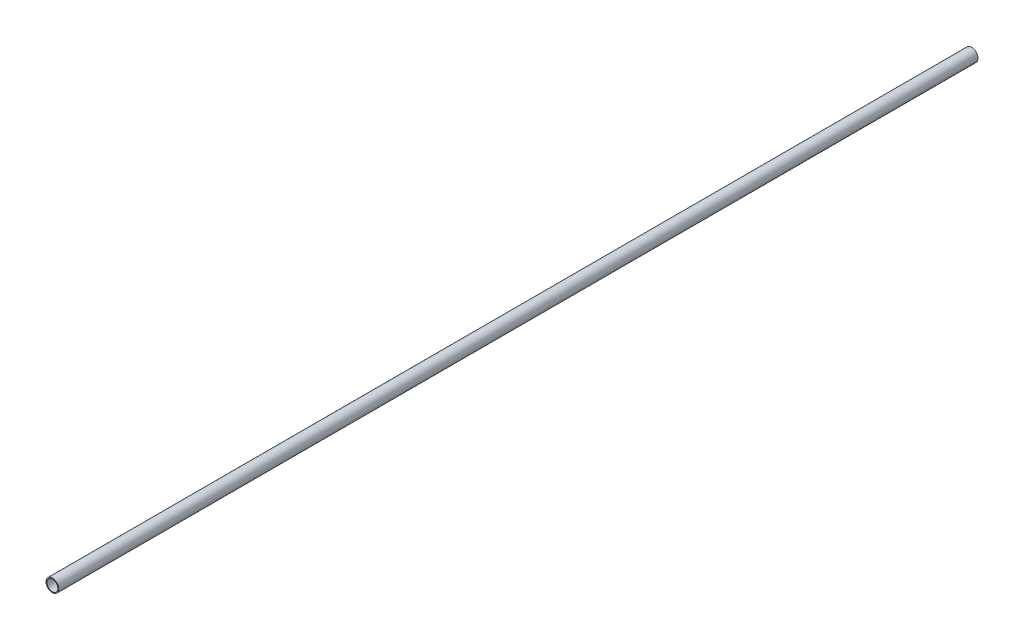
ISO-10303-21;
HEADER;
FILE_DESCRIPTION(('STEP AP214'),'2;1');
FILE_NAME('part.step','',(''),(''),'','','');
FILE_SCHEMA(('AUTOMOTIVE_DESIGN { 1 0 10303 214 1 1 1 1 }'));
ENDSEC;
DATA;
#1=APPLICATION_CONTEXT('core data for automotive mechanical design processes');
#2=APPLICATION_PROTOCOL_DEFINITION('international standard','automotive_design',2000,#1);
#3=PRODUCT_CONTEXT('',#1,'mechanical');
#4=PRODUCT('Part','Part','',(#3));
#5=PRODUCT_RELATED_PRODUCT_CATEGORY('part','',(#4));
#6=PRODUCT_DEFINITION_FORMATION('','',#4);
#7=PRODUCT_DEFINITION_CONTEXT('part definition',#1,'design');
#8=PRODUCT_DEFINITION('design','',#6,#7);
#9=PRODUCT_DEFINITION_SHAPE('','',#8);
#10=(LENGTH_UNIT() NAMED_UNIT(*) SI_UNIT(.MILLI.,.METRE.));
#11=(NAMED_UNIT(*) PLANE_ANGLE_UNIT() SI_UNIT($,.RADIAN.));
#12=(NAMED_UNIT(*) SI_UNIT($,.STERADIAN.) SOLID_ANGLE_UNIT());
#13=UNCERTAINTY_MEASURE_WITH_UNIT(LENGTH_MEASURE(1.E-05),#10,'distance_accuracy_value','');
#14=(GEOMETRIC_REPRESENTATION_CONTEXT(3) GLOBAL_UNCERTAINTY_ASSIGNED_CONTEXT((#13)) GLOBAL_UNIT_ASSIGNED_CONTEXT((#10,
#11,#12)) REPRESENTATION_CONTEXT('',''));
#15=CARTESIAN_POINT('',(0.,0.,0.));
#16=DIRECTION('',(0.,0.,1.));
#17=DIRECTION('',(1.,0.,0.));
#18=AXIS2_PLACEMENT_3D('',#15,#16,#17);
#19=CARTESIAN_POINT('',(0.,0.,-457.2));
#20=DIRECTION('',(0.,0.,1.));
#21=DIRECTION('',(1.,0.,0.));
#22=AXIS2_PLACEMENT_3D('',#19,#20,#21);
#23=CYLINDRICAL_SURFACE('',#22,6.35);
#24=CARTESIAN_POINT('',(0.,0.,-457.2));
#25=DIRECTION('',(0.,0.,1.));
#26=DIRECTION('',(1.,0.,0.));
#27=AXIS2_PLACEMENT_3D('',#24,#25,#26);
#28=CIRCLE('',#27,6.35);
#29=CARTESIAN_POINT('',(6.35,0.,-457.2));
#30=VERTEX_POINT('',#29);
#31=EDGE_CURVE('E10',#30,#30,#28,.T.);
#32=ORIENTED_EDGE('',*,*,#31,.T.);
#33=EDGE_LOOP('',(#32));
#34=FACE_BOUND('',#33,.T.);
#35=CARTESIAN_POINT('',(0.,0.,457.2));
#36=DIRECTION('',(0.,0.,1.));
#37=DIRECTION('',(1.,0.,0.));
#38=AXIS2_PLACEMENT_3D('',#35,#36,#37);
#39=CIRCLE('',#38,6.35);
#40=CARTESIAN_POINT('',(6.35,0.,457.2));
#41=VERTEX_POINT('',#40);
#42=EDGE_CURVE('E46',#41,#41,#39,.T.);
#43=ORIENTED_EDGE('',*,*,#42,.F.);
#44=EDGE_LOOP('',(#43));
#45=FACE_BOUND('',#44,.T.);
#46=ADVANCED_FACE('F36',(#34,#45),#23,.T.);
#47=CARTESIAN_POINT('',(0.,0.,-457.2));
#48=DIRECTION('',(0.,0.,1.));
#49=DIRECTION('',(1.,0.,0.));
#50=AXIS2_PLACEMENT_3D('',#47,#48,#49);
#51=PLANE('',#50);
#52=CARTESIAN_POINT('',(0.,0.,-457.2));
#53=DIRECTION('',(0.,0.,1.));
#54=DIRECTION('',(1.,0.,0.));
#55=AXIS2_PLACEMENT_3D('',#52,#53,#54);
#56=CIRCLE('',#55,5.461);
#57=CARTESIAN_POINT('',(5.461,0.,-457.2));
#58=VERTEX_POINT('',#57);
#59=EDGE_CURVE('E42',#58,#58,#56,.T.);
#60=ORIENTED_EDGE('',*,*,#59,.T.);
#61=EDGE_LOOP('',(#60));
#62=FACE_BOUND('',#61,.T.);
#63=ORIENTED_EDGE('',*,*,#31,.F.);
#64=EDGE_LOOP('',(#63));
#65=FACE_BOUND('',#64,.T.);
#66=ADVANCED_FACE('F65',(#62,#65),#51,.F.);
#67=CARTESIAN_POINT('',(0.,0.,-457.2));
#68=DIRECTION('',(0.,0.,1.));
#69=DIRECTION('',(1.,0.,0.));
#70=AXIS2_PLACEMENT_3D('',#67,#68,#69);
#71=CYLINDRICAL_SURFACE('',#70,5.461);
#72=ORIENTED_EDGE('',*,*,#59,.F.);
#73=EDGE_LOOP('',(#72));
#74=FACE_BOUND('',#73,.T.);
#75=CARTESIAN_POINT('',(0.,0.,457.2));
#76=DIRECTION('',(0.,0.,1.));
#77=DIRECTION('',(1.,0.,0.));
#78=AXIS2_PLACEMENT_3D('',#75,#76,#77);
#79=CIRCLE('',#78,5.461);
#80=CARTESIAN_POINT('',(5.461,0.,457.2));
#81=VERTEX_POINT('',#80);
#82=EDGE_CURVE('E50',#81,#81,#79,.T.);
#83=ORIENTED_EDGE('',*,*,#82,.T.);
#84=EDGE_LOOP('',(#83));
#85=FACE_BOUND('',#84,.T.);
#86=ADVANCED_FACE('F56',(#74,#85),#71,.F.);
#87=CARTESIAN_POINT('',(0.,0.,457.2));
#88=DIRECTION('',(0.,0.,1.));
#89=DIRECTION('',(1.,0.,0.));
#90=AXIS2_PLACEMENT_3D('',#87,#88,#89);
#91=PLANE('',#90);
#92=ORIENTED_EDGE('',*,*,#42,.T.);
#93=EDGE_LOOP('',(#92));
#94=FACE_BOUND('',#93,.T.);
#95=ORIENTED_EDGE('',*,*,#82,.F.);
#96=EDGE_LOOP('',(#95));
#97=FACE_BOUND('',#96,.T.);
#98=ADVANCED_FACE('F58',(#94,#97),#91,.T.);
#99=CLOSED_SHELL('',(#46,#66,#86,#98));
#100=MANIFOLD_SOLID_BREP('B2',#99);
#101=ADVANCED_BREP_SHAPE_REPRESENTATION('',(#18,#100),#14);
#102=SHAPE_DEFINITION_REPRESENTATION(#9,#101);
ENDSEC;
END-ISO-10303-21;
